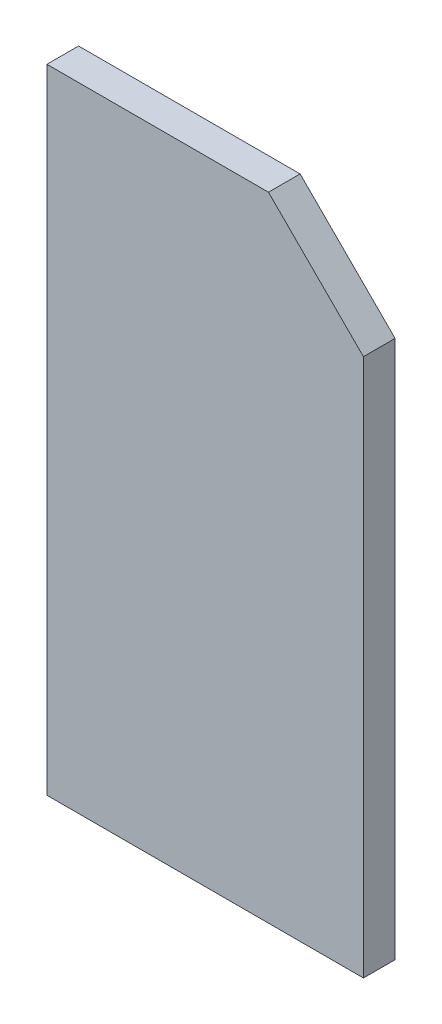
ISO-10303-21;
HEADER;
FILE_DESCRIPTION(('STEP AP214'),'2;1');
FILE_NAME('part.step','',(''),(''),'','','');
FILE_SCHEMA(('AUTOMOTIVE_DESIGN { 1 0 10303 214 1 1 1 1 }'));
ENDSEC;
DATA;
#1=APPLICATION_CONTEXT('core data for automotive mechanical design processes');
#2=APPLICATION_PROTOCOL_DEFINITION('international standard','automotive_design',2000,#1);
#3=PRODUCT_CONTEXT('',#1,'mechanical');
#4=PRODUCT('Part','Part','',(#3));
#5=PRODUCT_RELATED_PRODUCT_CATEGORY('part','',(#4));
#6=PRODUCT_DEFINITION_FORMATION('','',#4);
#7=PRODUCT_DEFINITION_CONTEXT('part definition',#1,'design');
#8=PRODUCT_DEFINITION('design','',#6,#7);
#9=PRODUCT_DEFINITION_SHAPE('','',#8);
#10=(LENGTH_UNIT() NAMED_UNIT(*) SI_UNIT(.MILLI.,.METRE.));
#11=(NAMED_UNIT(*) PLANE_ANGLE_UNIT() SI_UNIT($,.RADIAN.));
#12=(NAMED_UNIT(*) SI_UNIT($,.STERADIAN.) SOLID_ANGLE_UNIT());
#13=UNCERTAINTY_MEASURE_WITH_UNIT(LENGTH_MEASURE(1.E-05),#10,'distance_accuracy_value','');
#14=(GEOMETRIC_REPRESENTATION_CONTEXT(3) GLOBAL_UNCERTAINTY_ASSIGNED_CONTEXT((#13)) GLOBAL_UNIT_ASSIGNED_CONTEXT((#10,
#11,#12)) REPRESENTATION_CONTEXT('',''));
#15=CARTESIAN_POINT('',(0.,0.,0.));
#16=DIRECTION('',(0.,0.,1.));
#17=DIRECTION('',(1.,0.,0.));
#18=AXIS2_PLACEMENT_3D('',#15,#16,#17);
#19=CARTESIAN_POINT('',(0.,0.,25.));
#20=DIRECTION('',(1.,0.,0.));
#21=DIRECTION('',(0.,0.,-1.));
#22=AXIS2_PLACEMENT_3D('',#19,#20,#21);
#23=PLANE('',#22);
#24=DIRECTION('',(0.,-1.,0.));
#25=VECTOR('',#24,1.);
#26=CARTESIAN_POINT('',(0.,0.,0.));
#27=LINE('',#26,#25);
#28=CARTESIAN_POINT('',(0.,500.,0.));
#29=VERTEX_POINT('',#28);
#30=CARTESIAN_POINT('',(0.,0.,0.));
#31=VERTEX_POINT('',#30);
#32=EDGE_CURVE('E107',#29,#31,#27,.T.);
#33=ORIENTED_EDGE('',*,*,#32,.T.);
#34=DIRECTION('',(0.,0.,-1.));
#35=VECTOR('',#34,1.);
#36=CARTESIAN_POINT('',(0.,0.,25.));
#37=LINE('',#36,#35);
#38=CARTESIAN_POINT('',(0.,0.,25.));
#39=VERTEX_POINT('',#38);
#40=EDGE_CURVE('E43',#39,#31,#37,.T.);
#41=ORIENTED_EDGE('',*,*,#40,.F.);
#42=DIRECTION('',(0.,-1.,0.));
#43=VECTOR('',#42,1.);
#44=CARTESIAN_POINT('',(0.,0.,25.));
#45=LINE('',#44,#43);
#46=CARTESIAN_POINT('',(0.,500.,25.));
#47=VERTEX_POINT('',#46);
#48=EDGE_CURVE('E115',#47,#39,#45,.T.);
#49=ORIENTED_EDGE('',*,*,#48,.F.);
#50=DIRECTION('',(0.,0.,-1.));
#51=VECTOR('',#50,1.);
#52=CARTESIAN_POINT('',(0.,500.,25.));
#53=LINE('',#52,#51);
#54=EDGE_CURVE('E99',#47,#29,#53,.T.);
#55=ORIENTED_EDGE('',*,*,#54,.T.);
#56=EDGE_LOOP('',(#33,#41,#49,#55));
#57=FACE_BOUND('',#56,.T.);
#58=ADVANCED_FACE('F36',(#57),#23,.F.);
#59=CARTESIAN_POINT('',(0.,0.,25.));
#60=DIRECTION('',(0.,1.,0.));
#61=DIRECTION('',(0.,0.,1.));
#62=AXIS2_PLACEMENT_3D('',#59,#60,#61);
#63=PLANE('',#62);
#64=DIRECTION('',(1.,0.,0.));
#65=VECTOR('',#64,1.);
#66=CARTESIAN_POINT('',(0.,0.,0.));
#67=LINE('',#66,#65);
#68=CARTESIAN_POINT('',(250.,0.,0.));
#69=VERTEX_POINT('',#68);
#70=EDGE_CURVE('E110',#31,#69,#67,.T.);
#71=ORIENTED_EDGE('',*,*,#70,.T.);
#72=DIRECTION('',(0.,0.,-1.));
#73=VECTOR('',#72,1.);
#74=CARTESIAN_POINT('',(250.,0.,25.));
#75=LINE('',#74,#73);
#76=CARTESIAN_POINT('',(250.,0.,25.));
#77=VERTEX_POINT('',#76);
#78=EDGE_CURVE('E102',#77,#69,#75,.T.);
#79=ORIENTED_EDGE('',*,*,#78,.F.);
#80=DIRECTION('',(1.,0.,0.));
#81=VECTOR('',#80,1.);
#82=CARTESIAN_POINT('',(0.,0.,25.));
#83=LINE('',#82,#81);
#84=EDGE_CURVE('E82',#39,#77,#83,.T.);
#85=ORIENTED_EDGE('',*,*,#84,.F.);
#86=ORIENTED_EDGE('',*,*,#40,.T.);
#87=EDGE_LOOP('',(#71,#79,#85,#86));
#88=FACE_BOUND('',#87,.T.);
#89=ADVANCED_FACE('F119',(#88),#63,.F.);
#90=CARTESIAN_POINT('',(250.,500.,25.));
#91=DIRECTION('',(-1.,0.,0.));
#92=DIRECTION('',(0.,-1.,0.));
#93=AXIS2_PLACEMENT_3D('',#90,#91,#92);
#94=PLANE('',#93);
#95=DIRECTION('',(0.,1.,0.));
#96=VECTOR('',#95,1.);
#97=CARTESIAN_POINT('',(250.,500.,0.));
#98=LINE('',#97,#96);
#99=CARTESIAN_POINT('',(250.,425.,0.));
#100=VERTEX_POINT('',#99);
#101=EDGE_CURVE('E112',#69,#100,#98,.T.);
#102=ORIENTED_EDGE('',*,*,#101,.T.);
#103=DIRECTION('',(0.,0.,1.));
#104=VECTOR('',#103,1.);
#105=CARTESIAN_POINT('',(250.,425.,-0.399999999999998));
#106=LINE('',#105,#104);
#107=CARTESIAN_POINT('',(250.,425.,25.));
#108=VERTEX_POINT('',#107);
#109=EDGE_CURVE('E49',#100,#108,#106,.T.);
#110=ORIENTED_EDGE('',*,*,#109,.T.);
#111=DIRECTION('',(0.,1.,0.));
#112=VECTOR('',#111,1.);
#113=CARTESIAN_POINT('',(250.,500.,25.));
#114=LINE('',#113,#112);
#115=EDGE_CURVE('E96',#77,#108,#114,.T.);
#116=ORIENTED_EDGE('',*,*,#115,.F.);
#117=ORIENTED_EDGE('',*,*,#78,.T.);
#118=EDGE_LOOP('',(#102,#110,#116,#117));
#119=FACE_BOUND('',#118,.T.);
#120=ADVANCED_FACE('F126',(#119),#94,.F.);
#121=CARTESIAN_POINT('',(0.,500.,25.));
#122=DIRECTION('',(0.,-1.,0.));
#123=DIRECTION('',(1.,0.,0.));
#124=AXIS2_PLACEMENT_3D('',#121,#122,#123);
#125=PLANE('',#124);
#126=DIRECTION('',(-1.,0.,0.));
#127=VECTOR('',#126,1.);
#128=CARTESIAN_POINT('',(0.,500.,25.));
#129=LINE('',#128,#127);
#130=CARTESIAN_POINT('',(175.,500.,25.));
#131=VERTEX_POINT('',#130);
#132=EDGE_CURVE('E58',#131,#47,#129,.T.);
#133=ORIENTED_EDGE('',*,*,#132,.F.);
#134=DIRECTION('',(0.,0.,1.));
#135=VECTOR('',#134,1.);
#136=CARTESIAN_POINT('',(175.,500.,-0.399999999999998));
#137=LINE('',#136,#135);
#138=CARTESIAN_POINT('',(175.,500.,0.));
#139=VERTEX_POINT('',#138);
#140=EDGE_CURVE('E89',#139,#131,#137,.T.);
#141=ORIENTED_EDGE('',*,*,#140,.F.);
#142=DIRECTION('',(-1.,0.,0.));
#143=VECTOR('',#142,1.);
#144=CARTESIAN_POINT('',(0.,500.,0.));
#145=LINE('',#144,#143);
#146=EDGE_CURVE('E76',#139,#29,#145,.T.);
#147=ORIENTED_EDGE('',*,*,#146,.T.);
#148=ORIENTED_EDGE('',*,*,#54,.F.);
#149=EDGE_LOOP('',(#133,#141,#147,#148));
#150=FACE_BOUND('',#149,.T.);
#151=ADVANCED_FACE('F98',(#150),#125,.F.);
#152=CARTESIAN_POINT('',(0.,0.,25.));
#153=DIRECTION('',(0.,0.,-1.));
#154=DIRECTION('',(-1.,0.,0.));
#155=AXIS2_PLACEMENT_3D('',#152,#153,#154);
#156=PLANE('',#155);
#157=ORIENTED_EDGE('',*,*,#115,.T.);
#158=DIRECTION('',(0.707106781186548,-0.707106781186548,0.));
#159=VECTOR('',#158,1.);
#160=CARTESIAN_POINT('',(175.,500.,25.));
#161=LINE('',#160,#159);
#162=EDGE_CURVE('E91',#131,#108,#161,.T.);
#163=ORIENTED_EDGE('',*,*,#162,.F.);
#164=ORIENTED_EDGE('',*,*,#132,.T.);
#165=ORIENTED_EDGE('',*,*,#48,.T.);
#166=ORIENTED_EDGE('',*,*,#84,.T.);
#167=EDGE_LOOP('',(#157,#163,#164,#165,#166));
#168=FACE_BOUND('',#167,.T.);
#169=ADVANCED_FACE('F94',(#168),#156,.F.);
#170=CARTESIAN_POINT('',(0.,0.,0.));
#171=DIRECTION('',(0.,0.,-1.));
#172=DIRECTION('',(-1.,0.,0.));
#173=AXIS2_PLACEMENT_3D('',#170,#171,#172);
#174=PLANE('',#173);
#175=DIRECTION('',(-0.707106781186548,0.707106781186548,0.));
#176=VECTOR('',#175,1.);
#177=CARTESIAN_POINT('',(337.5,337.5,0.));
#178=LINE('',#177,#176);
#179=EDGE_CURVE('E11',#100,#139,#178,.T.);
#180=ORIENTED_EDGE('',*,*,#179,.F.);
#181=ORIENTED_EDGE('',*,*,#101,.F.);
#182=ORIENTED_EDGE('',*,*,#70,.F.);
#183=ORIENTED_EDGE('',*,*,#32,.F.);
#184=ORIENTED_EDGE('',*,*,#146,.F.);
#185=EDGE_LOOP('',(#180,#181,#182,#183,#184));
#186=FACE_BOUND('',#185,.T.);
#187=ADVANCED_FACE('F123',(#186),#174,.T.);
#188=CARTESIAN_POINT('',(175.,500.,-0.399999999999998));
#189=DIRECTION('',(-0.707106781186548,-0.707106781186548,0.));
#190=DIRECTION('',(0.707106781186548,-0.707106781186548,0.));
#191=AXIS2_PLACEMENT_3D('',#188,#189,#190);
#192=PLANE('',#191);
#193=ORIENTED_EDGE('',*,*,#179,.T.);
#194=ORIENTED_EDGE('',*,*,#140,.T.);
#195=ORIENTED_EDGE('',*,*,#162,.T.);
#196=ORIENTED_EDGE('',*,*,#109,.F.);
#197=EDGE_LOOP('',(#193,#194,#195,#196));
#198=FACE_BOUND('',#197,.T.);
#199=ADVANCED_FACE('F90',(#198),#192,.F.);
#200=CLOSED_SHELL('',(#58,#89,#120,#151,#169,#187,#199));
#201=MANIFOLD_SOLID_BREP('B2',#200);
#202=ADVANCED_BREP_SHAPE_REPRESENTATION('',(#18,#201),#14);
#203=SHAPE_DEFINITION_REPRESENTATION(#9,#202);
ENDSEC;
END-ISO-10303-21;
